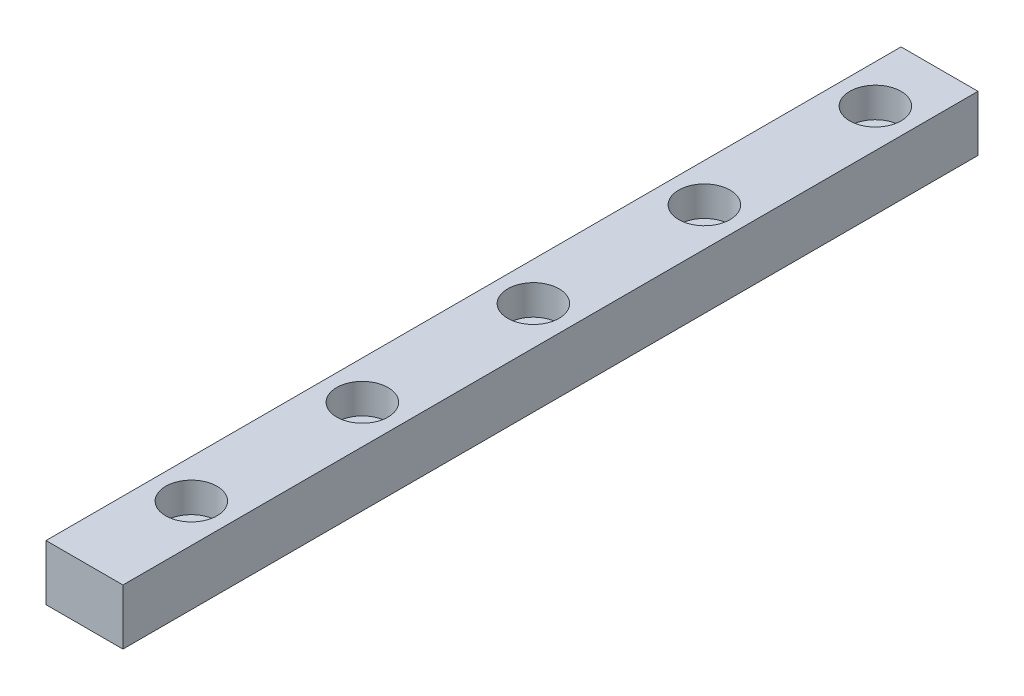
ISO-10303-21;
HEADER;
FILE_DESCRIPTION(('STEP AP214'),'2;1');
FILE_NAME('part.step','',(''),(''),'','','');
FILE_SCHEMA(('AUTOMOTIVE_DESIGN { 1 0 10303 214 1 1 1 1 }'));
ENDSEC;
DATA;
#1=APPLICATION_CONTEXT('core data for automotive mechanical design processes');
#2=APPLICATION_PROTOCOL_DEFINITION('international standard','automotive_design',2000,#1);
#3=PRODUCT_CONTEXT('',#1,'mechanical');
#4=PRODUCT('Part','Part','',(#3));
#5=PRODUCT_RELATED_PRODUCT_CATEGORY('part','',(#4));
#6=PRODUCT_DEFINITION_FORMATION('','',#4);
#7=PRODUCT_DEFINITION_CONTEXT('part definition',#1,'design');
#8=PRODUCT_DEFINITION('design','',#6,#7);
#9=PRODUCT_DEFINITION_SHAPE('','',#8);
#10=(LENGTH_UNIT() NAMED_UNIT(*) SI_UNIT(.MILLI.,.METRE.));
#11=(NAMED_UNIT(*) PLANE_ANGLE_UNIT() SI_UNIT($,.RADIAN.));
#12=(NAMED_UNIT(*) SI_UNIT($,.STERADIAN.) SOLID_ANGLE_UNIT());
#13=UNCERTAINTY_MEASURE_WITH_UNIT(LENGTH_MEASURE(1.E-05),#10,'distance_accuracy_value','');
#14=(GEOMETRIC_REPRESENTATION_CONTEXT(3) GLOBAL_UNCERTAINTY_ASSIGNED_CONTEXT((#13)) GLOBAL_UNIT_ASSIGNED_CONTEXT((#10,
#11,#12)) REPRESENTATION_CONTEXT('',''));
#15=CARTESIAN_POINT('',(0.,0.,0.));
#16=DIRECTION('',(0.,0.,1.));
#17=DIRECTION('',(1.,0.,0.));
#18=AXIS2_PLACEMENT_3D('',#15,#16,#17);
#19=CARTESIAN_POINT('',(8.23043630082632E-13,-3.25,-1.76483252234438));
#20=DIRECTION('',(0.,1.,0.));
#21=DIRECTION('',(0.,0.,1.));
#22=AXIS2_PLACEMENT_3D('',#19,#20,#21);
#23=CYLINDRICAL_SURFACE('',#22,1.75000000645171);
#24=CARTESIAN_POINT('',(8.23043630082632E-13,-3.25,-1.76483252234438));
#25=DIRECTION('',(0.,1.,0.));
#26=DIRECTION('',(0.,0.,1.));
#27=AXIS2_PLACEMENT_3D('',#24,#25,#26);
#28=CIRCLE('',#27,1.75000000645171);
#29=CARTESIAN_POINT('',(8.23043630082632E-13,-3.25,-0.0148325158926758));
#30=VERTEX_POINT('',#29);
#31=EDGE_CURVE('E131',#30,#30,#28,.T.);
#32=CARTESIAN_POINT('',(8.23043630082632E-13,-0.25,-1.76483252234438));
#33=DIRECTION('',(0.,1.,0.));
#34=DIRECTION('',(0.,0.,1.));
#35=AXIS2_PLACEMENT_3D('',#32,#33,#34);
#36=CIRCLE('',#35,1.75000000645171);
#37=CARTESIAN_POINT('',(8.23043630082632E-13,-0.25,-0.0148325158926758));
#38=VERTEX_POINT('',#37);
#39=EDGE_CURVE('E45',#38,#38,#36,.F.);
#40=CARTESIAN_POINT('',(8.23043630082632E-13,-3.25,-0.0148325158926758));
#41=CARTESIAN_POINT('',(8.23043630082632E-13,-3.21875,-0.0148325158926758));
#42=CARTESIAN_POINT('',(8.23043630082632E-13,-3.1875,-0.0148325158926758));
#43=CARTESIAN_POINT('',(8.23043630082632E-13,-3.125,-0.0148325158926758));
#44=CARTESIAN_POINT('',(8.23043630082632E-13,-3.09375,-0.0148325158926758));
#45=CARTESIAN_POINT('',(8.23043630082632E-13,-3.03125,-0.0148325158926758));
#46=CARTESIAN_POINT('',(8.23043630082632E-13,-3.,-0.0148325158926758));
#47=CARTESIAN_POINT('',(8.23043630082632E-13,-2.9375,-0.0148325158926758));
#48=CARTESIAN_POINT('',(8.23043630082632E-13,-2.90625,-0.0148325158926758));
#49=CARTESIAN_POINT('',(8.23043630082632E-13,-2.84375,-0.0148325158926758));
#50=CARTESIAN_POINT('',(8.23043630082632E-13,-2.8125,-0.0148325158926758));
#51=CARTESIAN_POINT('',(8.23043630082632E-13,-2.75,-0.0148325158926758));
#52=CARTESIAN_POINT('',(8.23043630082632E-13,-2.71875,-0.0148325158926758));
#53=CARTESIAN_POINT('',(8.23043630082632E-13,-2.65625,-0.0148325158926758));
#54=CARTESIAN_POINT('',(8.23043630082632E-13,-2.625,-0.0148325158926758));
#55=CARTESIAN_POINT('',(8.23043630082632E-13,-2.5625,-0.0148325158926758));
#56=CARTESIAN_POINT('',(8.23043630082632E-13,-2.53125,-0.0148325158926758));
#57=CARTESIAN_POINT('',(8.23043630082632E-13,-2.46875,-0.0148325158926758));
#58=CARTESIAN_POINT('',(8.23043630082632E-13,-2.4375,-0.0148325158926758));
#59=CARTESIAN_POINT('',(8.23043630082632E-13,-2.375,-0.0148325158926758));
#60=CARTESIAN_POINT('',(8.23043630082632E-13,-2.34375,-0.0148325158926758));
#61=CARTESIAN_POINT('',(8.23043630082632E-13,-2.28125,-0.0148325158926758));
#62=CARTESIAN_POINT('',(8.23043630082632E-13,-2.25,-0.0148325158926758));
#63=CARTESIAN_POINT('',(8.23043630082632E-13,-2.1875,-0.0148325158926758));
#64=CARTESIAN_POINT('',(8.23043630082632E-13,-2.15625,-0.0148325158926758));
#65=CARTESIAN_POINT('',(8.23043630082632E-13,-2.09375,-0.0148325158926758));
#66=CARTESIAN_POINT('',(8.23043630082632E-13,-2.0625,-0.0148325158926758));
#67=CARTESIAN_POINT('',(8.23043630082632E-13,-2.,-0.0148325158926758));
#68=CARTESIAN_POINT('',(8.23043630082632E-13,-1.96875,-0.0148325158926758));
#69=CARTESIAN_POINT('',(8.23043630082632E-13,-1.90625,-0.0148325158926758));
#70=CARTESIAN_POINT('',(8.23043630082632E-13,-1.875,-0.0148325158926758));
#71=CARTESIAN_POINT('',(8.23043630082632E-13,-1.8125,-0.0148325158926758));
#72=CARTESIAN_POINT('',(8.23043630082632E-13,-1.78125,-0.0148325158926758));
#73=CARTESIAN_POINT('',(8.23043630082632E-13,-1.71875,-0.0148325158926758));
#74=CARTESIAN_POINT('',(8.23043630082632E-13,-1.6875,-0.0148325158926758));
#75=CARTESIAN_POINT('',(8.23043630082632E-13,-1.625,-0.0148325158926758));
#76=CARTESIAN_POINT('',(8.23043630082632E-13,-1.59375,-0.0148325158926758));
#77=CARTESIAN_POINT('',(8.23043630082632E-13,-1.53125,-0.0148325158926758));
#78=CARTESIAN_POINT('',(8.23043630082632E-13,-1.5,-0.0148325158926758));
#79=CARTESIAN_POINT('',(8.23043630082632E-13,-1.4375,-0.0148325158926758));
#80=CARTESIAN_POINT('',(8.23043630082632E-13,-1.40625,-0.0148325158926758));
#81=CARTESIAN_POINT('',(8.23043630082632E-13,-1.34375,-0.0148325158926758));
#82=CARTESIAN_POINT('',(8.23043630082632E-13,-1.3125,-0.0148325158926758));
#83=CARTESIAN_POINT('',(8.23043630082632E-13,-1.25,-0.0148325158926758));
#84=CARTESIAN_POINT('',(8.23043630082632E-13,-1.21875,-0.0148325158926758));
#85=CARTESIAN_POINT('',(8.23043630082632E-13,-1.15625,-0.0148325158926758));
#86=CARTESIAN_POINT('',(8.23043630082632E-13,-1.125,-0.0148325158926758));
#87=CARTESIAN_POINT('',(8.23043630082632E-13,-1.0625,-0.0148325158926758));
#88=CARTESIAN_POINT('',(8.23043630082632E-13,-1.03125,-0.0148325158926758));
#89=CARTESIAN_POINT('',(8.23043630082632E-13,-0.96875,-0.0148325158926758));
#90=CARTESIAN_POINT('',(8.23043630082632E-13,-0.9375,-0.0148325158926758));
#91=CARTESIAN_POINT('',(8.23043630082632E-13,-0.875,-0.0148325158926758));
#92=CARTESIAN_POINT('',(8.23043630082632E-13,-0.84375,-0.0148325158926758));
#93=CARTESIAN_POINT('',(8.23043630082632E-13,-0.78125,-0.0148325158926758));
#94=CARTESIAN_POINT('',(8.23043630082632E-13,-0.75,-0.0148325158926758));
#95=CARTESIAN_POINT('',(8.23043630082632E-13,-0.6875,-0.0148325158926758));
#96=CARTESIAN_POINT('',(8.23043630082632E-13,-0.65625,-0.0148325158926758));
#97=CARTESIAN_POINT('',(8.23043630082632E-13,-0.59375,-0.0148325158926758));
#98=CARTESIAN_POINT('',(8.23043630082632E-13,-0.5625,-0.0148325158926758));
#99=CARTESIAN_POINT('',(8.23043630082632E-13,-0.5,-0.0148325158926758));
#100=CARTESIAN_POINT('',(8.23043630082632E-13,-0.46875,-0.0148325158926758));
#101=CARTESIAN_POINT('',(8.23043630082632E-13,-0.40625,-0.0148325158926758));
#102=CARTESIAN_POINT('',(8.23043630082632E-13,-0.375,-0.0148325158926758));
#103=CARTESIAN_POINT('',(8.23043630082632E-13,-0.3125,-0.0148325158926758));
#104=CARTESIAN_POINT('',(8.23043630082632E-13,-0.28125,-0.0148325158926758));
#105=CARTESIAN_POINT('',(8.23043630082632E-13,-0.25,-0.0148325158926758));
#106=B_SPLINE_CURVE_WITH_KNOTS('',3,(#40,#41,#42,#43,#44,#45,#46,#47,#48,#49,#50,#51,#52,#53,
#54,#55,#56,#57,#58,#59,#60,#61,#62,#63,#64,#65,#66,#67,#68,#69,#70,#71,#72,#73,#74,#75,#76,#77,
#78,#79,#80,#81,#82,#83,#84,#85,#86,#87,#88,#89,#90,#91,#92,#93,#94,#95,#96,#97,#98,#99,#100,
#101,#102,#103,#104,#105),.UNSPECIFIED.,.F.,.F.,(4,2,2,2,2,2,2,2,2,2,2,2,2,2,2,2,2,2,2,2,2,2,2,
2,2,2,2,2,2,2,2,2,4),(0.,0.0937499999999997,0.1875,0.28125,0.375,0.46875,0.5625,0.65625,0.75,
0.84375,0.9375,1.03125,1.125,1.21875,1.3125,1.40625,1.5,1.59375,1.6875,1.78125,1.875,1.96875,
2.0625,2.15625,2.25,2.34375,2.4375,2.53125,2.625,2.71875,2.8125,2.90625,3.),.UNSPECIFIED.);
#107=EDGE_CURVE('BSEAM41',#30,#38,#106,.T.);
#108=ORIENTED_EDGE('',*,*,#31,.F.);
#109=ORIENTED_EDGE('',*,*,#39,.F.);
#110=ORIENTED_EDGE('',*,*,#107,.T.);
#111=ORIENTED_EDGE('',*,*,#107,.F.);
#112=EDGE_LOOP('',(#108,#110,#109,#111));
#113=FACE_BOUND('',#112,.T.);
#114=ADVANCED_FACE('F41',(#113),#23,.F.);
#115=CARTESIAN_POINT('',(6.14779396551191E-13,-3.25,-21.7648325223444));
#116=DIRECTION('',(0.,1.,0.));
#117=DIRECTION('',(0.,0.,1.));
#118=AXIS2_PLACEMENT_3D('',#115,#116,#117);
#119=CYLINDRICAL_SURFACE('',#118,1.75000000645171);
#120=CARTESIAN_POINT('',(6.14779396551191E-13,-3.25,-21.7648325223444));
#121=DIRECTION('',(0.,1.,0.));
#122=DIRECTION('',(0.,0.,1.));
#123=AXIS2_PLACEMENT_3D('',#120,#121,#122);
#124=CIRCLE('',#123,1.75000000645171);
#125=CARTESIAN_POINT('',(6.14779396551191E-13,-3.25,-20.0148325158927));
#126=VERTEX_POINT('',#125);
#127=EDGE_CURVE('E135',#126,#126,#124,.T.);
#128=CARTESIAN_POINT('',(6.14779396551191E-13,-0.25,-21.7648325223444));
#129=DIRECTION('',(0.,1.,0.));
#130=DIRECTION('',(0.,0.,1.));
#131=AXIS2_PLACEMENT_3D('',#128,#129,#130);
#132=CIRCLE('',#131,1.75000000645171);
#133=CARTESIAN_POINT('',(6.14779396551191E-13,-0.25,-20.0148325158927));
#134=VERTEX_POINT('',#133);
#135=EDGE_CURVE('E126',#134,#134,#132,.F.);
#136=CARTESIAN_POINT('',(6.14779396551191E-13,-3.25,-20.0148325158927));
#137=CARTESIAN_POINT('',(6.14779396551191E-13,-3.21875,-20.0148325158927));
#138=CARTESIAN_POINT('',(6.14779396551191E-13,-3.1875,-20.0148325158927));
#139=CARTESIAN_POINT('',(6.14779396551191E-13,-3.125,-20.0148325158927));
#140=CARTESIAN_POINT('',(6.14779396551191E-13,-3.09375,-20.0148325158927));
#141=CARTESIAN_POINT('',(6.14779396551191E-13,-3.03125,-20.0148325158927));
#142=CARTESIAN_POINT('',(6.14779396551191E-13,-3.,-20.0148325158927));
#143=CARTESIAN_POINT('',(6.14779396551191E-13,-2.9375,-20.0148325158927));
#144=CARTESIAN_POINT('',(6.14779396551191E-13,-2.90625,-20.0148325158927));
#145=CARTESIAN_POINT('',(6.14779396551191E-13,-2.84375,-20.0148325158927));
#146=CARTESIAN_POINT('',(6.14779396551191E-13,-2.8125,-20.0148325158927));
#147=CARTESIAN_POINT('',(6.14779396551191E-13,-2.75,-20.0148325158927));
#148=CARTESIAN_POINT('',(6.14779396551191E-13,-2.71875,-20.0148325158927));
#149=CARTESIAN_POINT('',(6.14779396551191E-13,-2.65625,-20.0148325158927));
#150=CARTESIAN_POINT('',(6.14779396551191E-13,-2.625,-20.0148325158927));
#151=CARTESIAN_POINT('',(6.14779396551191E-13,-2.5625,-20.0148325158927));
#152=CARTESIAN_POINT('',(6.14779396551191E-13,-2.53125,-20.0148325158927));
#153=CARTESIAN_POINT('',(6.14779396551191E-13,-2.46875,-20.0148325158927));
#154=CARTESIAN_POINT('',(6.14779396551191E-13,-2.4375,-20.0148325158927));
#155=CARTESIAN_POINT('',(6.14779396551191E-13,-2.375,-20.0148325158927));
#156=CARTESIAN_POINT('',(6.14779396551191E-13,-2.34375,-20.0148325158927));
#157=CARTESIAN_POINT('',(6.14779396551191E-13,-2.28125,-20.0148325158927));
#158=CARTESIAN_POINT('',(6.14779396551191E-13,-2.25,-20.0148325158927));
#159=CARTESIAN_POINT('',(6.14779396551191E-13,-2.1875,-20.0148325158927));
#160=CARTESIAN_POINT('',(6.14779396551191E-13,-2.15625,-20.0148325158927));
#161=CARTESIAN_POINT('',(6.14779396551191E-13,-2.09375,-20.0148325158927));
#162=CARTESIAN_POINT('',(6.14779396551191E-13,-2.0625,-20.0148325158927));
#163=CARTESIAN_POINT('',(6.14779396551191E-13,-2.,-20.0148325158927));
#164=CARTESIAN_POINT('',(6.14779396551191E-13,-1.96875,-20.0148325158927));
#165=CARTESIAN_POINT('',(6.14779396551191E-13,-1.90625,-20.0148325158927));
#166=CARTESIAN_POINT('',(6.14779396551191E-13,-1.875,-20.0148325158927));
#167=CARTESIAN_POINT('',(6.14779396551191E-13,-1.8125,-20.0148325158927));
#168=CARTESIAN_POINT('',(6.14779396551191E-13,-1.78125,-20.0148325158927));
#169=CARTESIAN_POINT('',(6.14779396551191E-13,-1.71875,-20.0148325158927));
#170=CARTESIAN_POINT('',(6.14779396551191E-13,-1.6875,-20.0148325158927));
#171=CARTESIAN_POINT('',(6.14779396551191E-13,-1.625,-20.0148325158927));
#172=CARTESIAN_POINT('',(6.14779396551191E-13,-1.59375,-20.0148325158927));
#173=CARTESIAN_POINT('',(6.14779396551191E-13,-1.53125,-20.0148325158927));
#174=CARTESIAN_POINT('',(6.14779396551191E-13,-1.5,-20.0148325158927));
#175=CARTESIAN_POINT('',(6.14779396551191E-13,-1.4375,-20.0148325158927));
#176=CARTESIAN_POINT('',(6.14779396551191E-13,-1.40625,-20.0148325158927));
#177=CARTESIAN_POINT('',(6.14779396551191E-13,-1.34375,-20.0148325158927));
#178=CARTESIAN_POINT('',(6.14779396551191E-13,-1.3125,-20.0148325158927));
#179=CARTESIAN_POINT('',(6.14779396551191E-13,-1.25,-20.0148325158927));
#180=CARTESIAN_POINT('',(6.14779396551191E-13,-1.21875,-20.0148325158927));
#181=CARTESIAN_POINT('',(6.14779396551191E-13,-1.15625,-20.0148325158927));
#182=CARTESIAN_POINT('',(6.14779396551191E-13,-1.125,-20.0148325158927));
#183=CARTESIAN_POINT('',(6.14779396551191E-13,-1.0625,-20.0148325158927));
#184=CARTESIAN_POINT('',(6.14779396551191E-13,-1.03125,-20.0148325158927));
#185=CARTESIAN_POINT('',(6.14779396551191E-13,-0.96875,-20.0148325158927));
#186=CARTESIAN_POINT('',(6.14779396551191E-13,-0.9375,-20.0148325158927));
#187=CARTESIAN_POINT('',(6.14779396551191E-13,-0.875,-20.0148325158927));
#188=CARTESIAN_POINT('',(6.14779396551191E-13,-0.84375,-20.0148325158927));
#189=CARTESIAN_POINT('',(6.14779396551191E-13,-0.78125,-20.0148325158927));
#190=CARTESIAN_POINT('',(6.14779396551191E-13,-0.75,-20.0148325158927));
#191=CARTESIAN_POINT('',(6.14779396551191E-13,-0.6875,-20.0148325158927));
#192=CARTESIAN_POINT('',(6.14779396551191E-13,-0.65625,-20.0148325158927));
#193=CARTESIAN_POINT('',(6.14779396551191E-13,-0.59375,-20.0148325158927));
#194=CARTESIAN_POINT('',(6.14779396551191E-13,-0.5625,-20.0148325158927));
#195=CARTESIAN_POINT('',(6.14779396551191E-13,-0.5,-20.0148325158927));
#196=CARTESIAN_POINT('',(6.14779396551191E-13,-0.46875,-20.0148325158927));
#197=CARTESIAN_POINT('',(6.14779396551191E-13,-0.40625,-20.0148325158927));
#198=CARTESIAN_POINT('',(6.14779396551191E-13,-0.375,-20.0148325158927));
#199=CARTESIAN_POINT('',(6.14779396551191E-13,-0.3125,-20.0148325158927));
#200=CARTESIAN_POINT('',(6.14779396551191E-13,-0.28125,-20.0148325158927));
#201=CARTESIAN_POINT('',(6.14779396551191E-13,-0.25,-20.0148325158927));
#202=B_SPLINE_CURVE_WITH_KNOTS('',3,(#136,#137,#138,#139,#140,#141,#142,#143,#144,#145,#146,
#147,#148,#149,#150,#151,#152,#153,#154,#155,#156,#157,#158,#159,#160,#161,#162,#163,#164,#165,
#166,#167,#168,#169,#170,#171,#172,#173,#174,#175,#176,#177,#178,#179,#180,#181,#182,#183,#184,
#185,#186,#187,#188,#189,#190,#191,#192,#193,#194,#195,#196,#197,#198,#199,#200,#201),
.UNSPECIFIED.,.F.,.F.,(4,2,2,2,2,2,2,2,2,2,2,2,2,2,2,2,2,2,2,2,2,2,2,2,2,2,2,2,2,2,2,2,4),(0.,
0.0937499999999997,0.1875,0.28125,0.375,0.46875,0.5625,0.65625,0.75,0.84375,0.9375,1.03125,
1.125,1.21875,1.3125,1.40625,1.5,1.59375,1.6875,1.78125,1.875,1.96875,2.0625,2.15625,2.25,
2.34375,2.4375,2.53125,2.625,2.71875,2.8125,2.90625,3.),.UNSPECIFIED.);
#203=EDGE_CURVE('BSEAM214',#126,#134,#202,.T.);
#204=ORIENTED_EDGE('',*,*,#127,.F.);
#205=ORIENTED_EDGE('',*,*,#135,.F.);
#206=ORIENTED_EDGE('',*,*,#203,.T.);
#207=ORIENTED_EDGE('',*,*,#203,.F.);
#208=EDGE_LOOP('',(#204,#206,#205,#207));
#209=FACE_BOUND('',#208,.T.);
#210=ADVANCED_FACE('F214',(#209),#119,.F.);
#211=CARTESIAN_POINT('',(4.0651516301975E-13,-3.25,-41.7648325223444));
#212=DIRECTION('',(0.,1.,0.));
#213=DIRECTION('',(0.,0.,1.));
#214=AXIS2_PLACEMENT_3D('',#211,#212,#213);
#215=CYLINDRICAL_SURFACE('',#214,1.75000000645171);
#216=CARTESIAN_POINT('',(4.0651516301975E-13,-3.25,-41.7648325223444));
#217=DIRECTION('',(0.,1.,0.));
#218=DIRECTION('',(0.,0.,1.));
#219=AXIS2_PLACEMENT_3D('',#216,#217,#218);
#220=CIRCLE('',#219,1.75000000645171);
#221=CARTESIAN_POINT('',(4.0651516301975E-13,-3.25,-40.0148325158927));
#222=VERTEX_POINT('',#221);
#223=EDGE_CURVE('E140',#222,#222,#220,.T.);
#224=CARTESIAN_POINT('',(4.0651516301975E-13,-0.25,-41.7648325223444));
#225=DIRECTION('',(0.,1.,0.));
#226=DIRECTION('',(0.,0.,1.));
#227=AXIS2_PLACEMENT_3D('',#224,#225,#226);
#228=CIRCLE('',#227,1.75000000645171);
#229=CARTESIAN_POINT('',(4.0651516301975E-13,-0.25,-40.0148325158927));
#230=VERTEX_POINT('',#229);
#231=EDGE_CURVE('E124',#230,#230,#228,.F.);
#232=CARTESIAN_POINT('',(4.0651516301975E-13,-3.25,-40.0148325158927));
#233=CARTESIAN_POINT('',(4.0651516301975E-13,-3.21875,-40.0148325158927));
#234=CARTESIAN_POINT('',(4.0651516301975E-13,-3.1875,-40.0148325158927));
#235=CARTESIAN_POINT('',(4.0651516301975E-13,-3.125,-40.0148325158927));
#236=CARTESIAN_POINT('',(4.0651516301975E-13,-3.09375,-40.0148325158927));
#237=CARTESIAN_POINT('',(4.0651516301975E-13,-3.03125,-40.0148325158927));
#238=CARTESIAN_POINT('',(4.0651516301975E-13,-3.,-40.0148325158927));
#239=CARTESIAN_POINT('',(4.0651516301975E-13,-2.9375,-40.0148325158927));
#240=CARTESIAN_POINT('',(4.0651516301975E-13,-2.90625,-40.0148325158927));
#241=CARTESIAN_POINT('',(4.0651516301975E-13,-2.84375,-40.0148325158927));
#242=CARTESIAN_POINT('',(4.0651516301975E-13,-2.8125,-40.0148325158927));
#243=CARTESIAN_POINT('',(4.0651516301975E-13,-2.75,-40.0148325158927));
#244=CARTESIAN_POINT('',(4.0651516301975E-13,-2.71875,-40.0148325158927));
#245=CARTESIAN_POINT('',(4.0651516301975E-13,-2.65625,-40.0148325158927));
#246=CARTESIAN_POINT('',(4.0651516301975E-13,-2.625,-40.0148325158927));
#247=CARTESIAN_POINT('',(4.0651516301975E-13,-2.5625,-40.0148325158927));
#248=CARTESIAN_POINT('',(4.0651516301975E-13,-2.53125,-40.0148325158927));
#249=CARTESIAN_POINT('',(4.0651516301975E-13,-2.46875,-40.0148325158927));
#250=CARTESIAN_POINT('',(4.0651516301975E-13,-2.4375,-40.0148325158927));
#251=CARTESIAN_POINT('',(4.0651516301975E-13,-2.375,-40.0148325158927));
#252=CARTESIAN_POINT('',(4.0651516301975E-13,-2.34375,-40.0148325158927));
#253=CARTESIAN_POINT('',(4.0651516301975E-13,-2.28125,-40.0148325158927));
#254=CARTESIAN_POINT('',(4.0651516301975E-13,-2.25,-40.0148325158927));
#255=CARTESIAN_POINT('',(4.0651516301975E-13,-2.1875,-40.0148325158927));
#256=CARTESIAN_POINT('',(4.0651516301975E-13,-2.15625,-40.0148325158927));
#257=CARTESIAN_POINT('',(4.0651516301975E-13,-2.09375,-40.0148325158927));
#258=CARTESIAN_POINT('',(4.0651516301975E-13,-2.0625,-40.0148325158927));
#259=CARTESIAN_POINT('',(4.0651516301975E-13,-2.,-40.0148325158927));
#260=CARTESIAN_POINT('',(4.0651516301975E-13,-1.96875,-40.0148325158927));
#261=CARTESIAN_POINT('',(4.0651516301975E-13,-1.90625,-40.0148325158927));
#262=CARTESIAN_POINT('',(4.0651516301975E-13,-1.875,-40.0148325158927));
#263=CARTESIAN_POINT('',(4.0651516301975E-13,-1.8125,-40.0148325158927));
#264=CARTESIAN_POINT('',(4.0651516301975E-13,-1.78125,-40.0148325158927));
#265=CARTESIAN_POINT('',(4.0651516301975E-13,-1.71875,-40.0148325158927));
#266=CARTESIAN_POINT('',(4.0651516301975E-13,-1.6875,-40.0148325158927));
#267=CARTESIAN_POINT('',(4.0651516301975E-13,-1.625,-40.0148325158927));
#268=CARTESIAN_POINT('',(4.0651516301975E-13,-1.59375,-40.0148325158927));
#269=CARTESIAN_POINT('',(4.0651516301975E-13,-1.53125,-40.0148325158927));
#270=CARTESIAN_POINT('',(4.0651516301975E-13,-1.5,-40.0148325158927));
#271=CARTESIAN_POINT('',(4.0651516301975E-13,-1.4375,-40.0148325158927));
#272=CARTESIAN_POINT('',(4.0651516301975E-13,-1.40625,-40.0148325158927));
#273=CARTESIAN_POINT('',(4.0651516301975E-13,-1.34375,-40.0148325158927));
#274=CARTESIAN_POINT('',(4.0651516301975E-13,-1.3125,-40.0148325158927));
#275=CARTESIAN_POINT('',(4.0651516301975E-13,-1.25,-40.0148325158927));
#276=CARTESIAN_POINT('',(4.0651516301975E-13,-1.21875,-40.0148325158927));
#277=CARTESIAN_POINT('',(4.0651516301975E-13,-1.15625,-40.0148325158927));
#278=CARTESIAN_POINT('',(4.0651516301975E-13,-1.125,-40.0148325158927));
#279=CARTESIAN_POINT('',(4.0651516301975E-13,-1.0625,-40.0148325158927));
#280=CARTESIAN_POINT('',(4.0651516301975E-13,-1.03125,-40.0148325158927));
#281=CARTESIAN_POINT('',(4.0651516301975E-13,-0.96875,-40.0148325158927));
#282=CARTESIAN_POINT('',(4.0651516301975E-13,-0.9375,-40.0148325158927));
#283=CARTESIAN_POINT('',(4.0651516301975E-13,-0.875,-40.0148325158927));
#284=CARTESIAN_POINT('',(4.0651516301975E-13,-0.84375,-40.0148325158927));
#285=CARTESIAN_POINT('',(4.0651516301975E-13,-0.78125,-40.0148325158927));
#286=CARTESIAN_POINT('',(4.0651516301975E-13,-0.75,-40.0148325158927));
#287=CARTESIAN_POINT('',(4.0651516301975E-13,-0.6875,-40.0148325158927));
#288=CARTESIAN_POINT('',(4.0651516301975E-13,-0.65625,-40.0148325158927));
#289=CARTESIAN_POINT('',(4.0651516301975E-13,-0.59375,-40.0148325158927));
#290=CARTESIAN_POINT('',(4.0651516301975E-13,-0.5625,-40.0148325158927));
#291=CARTESIAN_POINT('',(4.0651516301975E-13,-0.5,-40.0148325158927));
#292=CARTESIAN_POINT('',(4.0651516301975E-13,-0.46875,-40.0148325158927));
#293=CARTESIAN_POINT('',(4.0651516301975E-13,-0.40625,-40.0148325158927));
#294=CARTESIAN_POINT('',(4.0651516301975E-13,-0.375,-40.0148325158927));
#295=CARTESIAN_POINT('',(4.0651516301975E-13,-0.3125,-40.0148325158927));
#296=CARTESIAN_POINT('',(4.0651516301975E-13,-0.28125,-40.0148325158927));
#297=CARTESIAN_POINT('',(4.0651516301975E-13,-0.25,-40.0148325158927));
#298=B_SPLINE_CURVE_WITH_KNOTS('',3,(#232,#233,#234,#235,#236,#237,#238,#239,#240,#241,#242,
#243,#244,#245,#246,#247,#248,#249,#250,#251,#252,#253,#254,#255,#256,#257,#258,#259,#260,#261,
#262,#263,#264,#265,#266,#267,#268,#269,#270,#271,#272,#273,#274,#275,#276,#277,#278,#279,#280,
#281,#282,#283,#284,#285,#286,#287,#288,#289,#290,#291,#292,#293,#294,#295,#296,#297),
.UNSPECIFIED.,.F.,.F.,(4,2,2,2,2,2,2,2,2,2,2,2,2,2,2,2,2,2,2,2,2,2,2,2,2,2,2,2,2,2,2,2,4),(0.,
0.0937499999999997,0.1875,0.28125,0.375,0.46875,0.5625,0.65625,0.75,0.84375,0.9375,1.03125,
1.125,1.21875,1.3125,1.40625,1.5,1.59375,1.6875,1.78125,1.875,1.96875,2.0625,2.15625,2.25,
2.34375,2.4375,2.53125,2.625,2.71875,2.8125,2.90625,3.),.UNSPECIFIED.);
#299=EDGE_CURVE('BSEAM221',#222,#230,#298,.T.);
#300=ORIENTED_EDGE('',*,*,#223,.F.);
#301=ORIENTED_EDGE('',*,*,#231,.F.);
#302=ORIENTED_EDGE('',*,*,#299,.T.);
#303=ORIENTED_EDGE('',*,*,#299,.F.);
#304=EDGE_LOOP('',(#300,#302,#301,#303));
#305=FACE_BOUND('',#304,.T.);
#306=ADVANCED_FACE('F221',(#305),#215,.F.);
#307=CARTESIAN_POINT('',(1.9825092948831E-13,-3.25,-61.7648325223444));
#308=DIRECTION('',(0.,1.,0.));
#309=DIRECTION('',(0.,0.,1.));
#310=AXIS2_PLACEMENT_3D('',#307,#308,#309);
#311=CYLINDRICAL_SURFACE('',#310,1.75000000645171);
#312=CARTESIAN_POINT('',(1.9825092948831E-13,-3.25,-61.7648325223444));
#313=DIRECTION('',(0.,1.,0.));
#314=DIRECTION('',(0.,0.,1.));
#315=AXIS2_PLACEMENT_3D('',#312,#313,#314);
#316=CIRCLE('',#315,1.75000000645171);
#317=CARTESIAN_POINT('',(1.9825092948831E-13,-3.25,-60.0148325158927));
#318=VERTEX_POINT('',#317);
#319=EDGE_CURVE('E145',#318,#318,#316,.T.);
#320=CARTESIAN_POINT('',(1.9825092948831E-13,-0.25,-61.7648325223444));
#321=DIRECTION('',(0.,1.,0.));
#322=DIRECTION('',(0.,0.,1.));
#323=AXIS2_PLACEMENT_3D('',#320,#321,#322);
#324=CIRCLE('',#323,1.75000000645171);
#325=CARTESIAN_POINT('',(1.9825092948831E-13,-0.25,-60.0148325158927));
#326=VERTEX_POINT('',#325);
#327=EDGE_CURVE('E120',#326,#326,#324,.F.);
#328=CARTESIAN_POINT('',(1.9825092948831E-13,-3.25,-60.0148325158927));
#329=CARTESIAN_POINT('',(1.9825092948831E-13,-3.21875,-60.0148325158927));
#330=CARTESIAN_POINT('',(1.9825092948831E-13,-3.1875,-60.0148325158927));
#331=CARTESIAN_POINT('',(1.9825092948831E-13,-3.125,-60.0148325158927));
#332=CARTESIAN_POINT('',(1.9825092948831E-13,-3.09375,-60.0148325158927));
#333=CARTESIAN_POINT('',(1.9825092948831E-13,-3.03125,-60.0148325158927));
#334=CARTESIAN_POINT('',(1.9825092948831E-13,-3.,-60.0148325158927));
#335=CARTESIAN_POINT('',(1.9825092948831E-13,-2.9375,-60.0148325158927));
#336=CARTESIAN_POINT('',(1.9825092948831E-13,-2.90625,-60.0148325158927));
#337=CARTESIAN_POINT('',(1.9825092948831E-13,-2.84375,-60.0148325158927));
#338=CARTESIAN_POINT('',(1.9825092948831E-13,-2.8125,-60.0148325158927));
#339=CARTESIAN_POINT('',(1.9825092948831E-13,-2.75,-60.0148325158927));
#340=CARTESIAN_POINT('',(1.9825092948831E-13,-2.71875,-60.0148325158927));
#341=CARTESIAN_POINT('',(1.9825092948831E-13,-2.65625,-60.0148325158927));
#342=CARTESIAN_POINT('',(1.9825092948831E-13,-2.625,-60.0148325158927));
#343=CARTESIAN_POINT('',(1.9825092948831E-13,-2.5625,-60.0148325158927));
#344=CARTESIAN_POINT('',(1.9825092948831E-13,-2.53125,-60.0148325158927));
#345=CARTESIAN_POINT('',(1.9825092948831E-13,-2.46875,-60.0148325158927));
#346=CARTESIAN_POINT('',(1.9825092948831E-13,-2.4375,-60.0148325158927));
#347=CARTESIAN_POINT('',(1.9825092948831E-13,-2.375,-60.0148325158927));
#348=CARTESIAN_POINT('',(1.9825092948831E-13,-2.34375,-60.0148325158927));
#349=CARTESIAN_POINT('',(1.9825092948831E-13,-2.28125,-60.0148325158927));
#350=CARTESIAN_POINT('',(1.9825092948831E-13,-2.25,-60.0148325158927));
#351=CARTESIAN_POINT('',(1.9825092948831E-13,-2.1875,-60.0148325158927));
#352=CARTESIAN_POINT('',(1.9825092948831E-13,-2.15625,-60.0148325158927));
#353=CARTESIAN_POINT('',(1.9825092948831E-13,-2.09375,-60.0148325158927));
#354=CARTESIAN_POINT('',(1.9825092948831E-13,-2.0625,-60.0148325158927));
#355=CARTESIAN_POINT('',(1.9825092948831E-13,-2.,-60.0148325158927));
#356=CARTESIAN_POINT('',(1.9825092948831E-13,-1.96875,-60.0148325158927));
#357=CARTESIAN_POINT('',(1.9825092948831E-13,-1.90625,-60.0148325158927));
#358=CARTESIAN_POINT('',(1.9825092948831E-13,-1.875,-60.0148325158927));
#359=CARTESIAN_POINT('',(1.9825092948831E-13,-1.8125,-60.0148325158927));
#360=CARTESIAN_POINT('',(1.9825092948831E-13,-1.78125,-60.0148325158927));
#361=CARTESIAN_POINT('',(1.9825092948831E-13,-1.71875,-60.0148325158927));
#362=CARTESIAN_POINT('',(1.9825092948831E-13,-1.6875,-60.0148325158927));
#363=CARTESIAN_POINT('',(1.9825092948831E-13,-1.625,-60.0148325158927));
#364=CARTESIAN_POINT('',(1.9825092948831E-13,-1.59375,-60.0148325158927));
#365=CARTESIAN_POINT('',(1.9825092948831E-13,-1.53125,-60.0148325158927));
#366=CARTESIAN_POINT('',(1.9825092948831E-13,-1.5,-60.0148325158927));
#367=CARTESIAN_POINT('',(1.9825092948831E-13,-1.4375,-60.0148325158927));
#368=CARTESIAN_POINT('',(1.9825092948831E-13,-1.40625,-60.0148325158927));
#369=CARTESIAN_POINT('',(1.9825092948831E-13,-1.34375,-60.0148325158927));
#370=CARTESIAN_POINT('',(1.9825092948831E-13,-1.3125,-60.0148325158927));
#371=CARTESIAN_POINT('',(1.9825092948831E-13,-1.25,-60.0148325158927));
#372=CARTESIAN_POINT('',(1.9825092948831E-13,-1.21875,-60.0148325158927));
#373=CARTESIAN_POINT('',(1.9825092948831E-13,-1.15625,-60.0148325158927));
#374=CARTESIAN_POINT('',(1.9825092948831E-13,-1.125,-60.0148325158927));
#375=CARTESIAN_POINT('',(1.9825092948831E-13,-1.0625,-60.0148325158927));
#376=CARTESIAN_POINT('',(1.9825092948831E-13,-1.03125,-60.0148325158927));
#377=CARTESIAN_POINT('',(1.9825092948831E-13,-0.96875,-60.0148325158927));
#378=CARTESIAN_POINT('',(1.9825092948831E-13,-0.9375,-60.0148325158927));
#379=CARTESIAN_POINT('',(1.9825092948831E-13,-0.875,-60.0148325158927));
#380=CARTESIAN_POINT('',(1.9825092948831E-13,-0.84375,-60.0148325158927));
#381=CARTESIAN_POINT('',(1.9825092948831E-13,-0.78125,-60.0148325158927));
#382=CARTESIAN_POINT('',(1.9825092948831E-13,-0.75,-60.0148325158927));
#383=CARTESIAN_POINT('',(1.9825092948831E-13,-0.6875,-60.0148325158927));
#384=CARTESIAN_POINT('',(1.9825092948831E-13,-0.65625,-60.0148325158927));
#385=CARTESIAN_POINT('',(1.9825092948831E-13,-0.59375,-60.0148325158927));
#386=CARTESIAN_POINT('',(1.9825092948831E-13,-0.5625,-60.0148325158927));
#387=CARTESIAN_POINT('',(1.9825092948831E-13,-0.5,-60.0148325158927));
#388=CARTESIAN_POINT('',(1.9825092948831E-13,-0.46875,-60.0148325158927));
#389=CARTESIAN_POINT('',(1.9825092948831E-13,-0.40625,-60.0148325158927));
#390=CARTESIAN_POINT('',(1.9825092948831E-13,-0.375,-60.0148325158927));
#391=CARTESIAN_POINT('',(1.9825092948831E-13,-0.3125,-60.0148325158927));
#392=CARTESIAN_POINT('',(1.9825092948831E-13,-0.28125,-60.0148325158927));
#393=CARTESIAN_POINT('',(1.9825092948831E-13,-0.25,-60.0148325158927));
#394=B_SPLINE_CURVE_WITH_KNOTS('',3,(#328,#329,#330,#331,#332,#333,#334,#335,#336,#337,#338,
#339,#340,#341,#342,#343,#344,#345,#346,#347,#348,#349,#350,#351,#352,#353,#354,#355,#356,#357,
#358,#359,#360,#361,#362,#363,#364,#365,#366,#367,#368,#369,#370,#371,#372,#373,#374,#375,#376,
#377,#378,#379,#380,#381,#382,#383,#384,#385,#386,#387,#388,#389,#390,#391,#392,#393),
.UNSPECIFIED.,.F.,.F.,(4,2,2,2,2,2,2,2,2,2,2,2,2,2,2,2,2,2,2,2,2,2,2,2,2,2,2,2,2,2,2,2,4),(0.,
0.0937499999999997,0.1875,0.28125,0.375,0.46875,0.5625,0.65625,0.75,0.84375,0.9375,1.03125,
1.125,1.21875,1.3125,1.40625,1.5,1.59375,1.6875,1.78125,1.875,1.96875,2.0625,2.15625,2.25,
2.34375,2.4375,2.53125,2.625,2.71875,2.8125,2.90625,3.),.UNSPECIFIED.);
#395=EDGE_CURVE('BSEAM272',#318,#326,#394,.T.);
#396=ORIENTED_EDGE('',*,*,#319,.F.);
#397=ORIENTED_EDGE('',*,*,#327,.F.);
#398=ORIENTED_EDGE('',*,*,#395,.T.);
#399=ORIENTED_EDGE('',*,*,#395,.F.);
#400=EDGE_LOOP('',(#396,#398,#397,#399));
#401=FACE_BOUND('',#400,.T.);
#402=ADVANCED_FACE('F272',(#401),#311,.F.);
#403=CARTESIAN_POINT('',(0.,-3.25,-81.7648325223444));
#404=DIRECTION('',(0.,1.,0.));
#405=DIRECTION('',(0.,0.,1.));
#406=AXIS2_PLACEMENT_3D('',#403,#404,#405);
#407=CYLINDRICAL_SURFACE('',#406,1.75000000645171);
#408=CARTESIAN_POINT('',(0.,-3.25,-81.7648325223444));
#409=DIRECTION('',(0.,1.,0.));
#410=DIRECTION('',(0.,0.,1.));
#411=AXIS2_PLACEMENT_3D('',#408,#409,#410);
#412=CIRCLE('',#411,1.75000000645171);
#413=CARTESIAN_POINT('',(0.,-3.25,-80.0148325158927));
#414=VERTEX_POINT('',#413);
#415=EDGE_CURVE('E111',#414,#414,#412,.T.);
#416=CARTESIAN_POINT('',(0.,-0.25,-81.7648325223444));
#417=DIRECTION('',(0.,1.,0.));
#418=DIRECTION('',(0.,0.,1.));
#419=AXIS2_PLACEMENT_3D('',#416,#417,#418);
#420=CIRCLE('',#419,1.75000000645171);
#421=CARTESIAN_POINT('',(0.,-0.25,-80.0148325158927));
#422=VERTEX_POINT('',#421);
#423=EDGE_CURVE('E117',#422,#422,#420,.F.);
#424=CARTESIAN_POINT('',(0.,-3.25,-80.0148325158927));
#425=CARTESIAN_POINT('',(0.,-3.21875,-80.0148325158927));
#426=CARTESIAN_POINT('',(0.,-3.1875,-80.0148325158927));
#427=CARTESIAN_POINT('',(0.,-3.125,-80.0148325158927));
#428=CARTESIAN_POINT('',(0.,-3.09375,-80.0148325158927));
#429=CARTESIAN_POINT('',(0.,-3.03125,-80.0148325158927));
#430=CARTESIAN_POINT('',(0.,-3.,-80.0148325158927));
#431=CARTESIAN_POINT('',(0.,-2.9375,-80.0148325158927));
#432=CARTESIAN_POINT('',(0.,-2.90625,-80.0148325158927));
#433=CARTESIAN_POINT('',(0.,-2.84375,-80.0148325158927));
#434=CARTESIAN_POINT('',(0.,-2.8125,-80.0148325158927));
#435=CARTESIAN_POINT('',(0.,-2.75,-80.0148325158927));
#436=CARTESIAN_POINT('',(0.,-2.71875,-80.0148325158927));
#437=CARTESIAN_POINT('',(0.,-2.65625,-80.0148325158927));
#438=CARTESIAN_POINT('',(0.,-2.625,-80.0148325158927));
#439=CARTESIAN_POINT('',(0.,-2.5625,-80.0148325158927));
#440=CARTESIAN_POINT('',(0.,-2.53125,-80.0148325158927));
#441=CARTESIAN_POINT('',(0.,-2.46875,-80.0148325158927));
#442=CARTESIAN_POINT('',(0.,-2.4375,-80.0148325158927));
#443=CARTESIAN_POINT('',(0.,-2.375,-80.0148325158927));
#444=CARTESIAN_POINT('',(0.,-2.34375,-80.0148325158927));
#445=CARTESIAN_POINT('',(0.,-2.28125,-80.0148325158927));
#446=CARTESIAN_POINT('',(0.,-2.25,-80.0148325158927));
#447=CARTESIAN_POINT('',(0.,-2.1875,-80.0148325158927));
#448=CARTESIAN_POINT('',(0.,-2.15625,-80.0148325158927));
#449=CARTESIAN_POINT('',(0.,-2.09375,-80.0148325158927));
#450=CARTESIAN_POINT('',(0.,-2.0625,-80.0148325158927));
#451=CARTESIAN_POINT('',(0.,-2.,-80.0148325158927));
#452=CARTESIAN_POINT('',(0.,-1.96875,-80.0148325158927));
#453=CARTESIAN_POINT('',(0.,-1.90625,-80.0148325158927));
#454=CARTESIAN_POINT('',(0.,-1.875,-80.0148325158927));
#455=CARTESIAN_POINT('',(0.,-1.8125,-80.0148325158927));
#456=CARTESIAN_POINT('',(0.,-1.78125,-80.0148325158927));
#457=CARTESIAN_POINT('',(0.,-1.71875,-80.0148325158927));
#458=CARTESIAN_POINT('',(0.,-1.6875,-80.0148325158927));
#459=CARTESIAN_POINT('',(0.,-1.625,-80.0148325158927));
#460=CARTESIAN_POINT('',(0.,-1.59375,-80.0148325158927));
#461=CARTESIAN_POINT('',(0.,-1.53125,-80.0148325158927));
#462=CARTESIAN_POINT('',(0.,-1.5,-80.0148325158927));
#463=CARTESIAN_POINT('',(0.,-1.4375,-80.0148325158927));
#464=CARTESIAN_POINT('',(0.,-1.40625,-80.0148325158927));
#465=CARTESIAN_POINT('',(0.,-1.34375,-80.0148325158927));
#466=CARTESIAN_POINT('',(0.,-1.3125,-80.0148325158927));
#467=CARTESIAN_POINT('',(0.,-1.25,-80.0148325158927));
#468=CARTESIAN_POINT('',(0.,-1.21875,-80.0148325158927));
#469=CARTESIAN_POINT('',(0.,-1.15625,-80.0148325158927));
#470=CARTESIAN_POINT('',(0.,-1.125,-80.0148325158927));
#471=CARTESIAN_POINT('',(0.,-1.0625,-80.0148325158927));
#472=CARTESIAN_POINT('',(0.,-1.03125,-80.0148325158927));
#473=CARTESIAN_POINT('',(0.,-0.96875,-80.0148325158927));
#474=CARTESIAN_POINT('',(0.,-0.9375,-80.0148325158927));
#475=CARTESIAN_POINT('',(0.,-0.875,-80.0148325158927));
#476=CARTESIAN_POINT('',(0.,-0.84375,-80.0148325158927));
#477=CARTESIAN_POINT('',(0.,-0.78125,-80.0148325158927));
#478=CARTESIAN_POINT('',(0.,-0.75,-80.0148325158927));
#479=CARTESIAN_POINT('',(0.,-0.6875,-80.0148325158927));
#480=CARTESIAN_POINT('',(0.,-0.65625,-80.0148325158927));
#481=CARTESIAN_POINT('',(0.,-0.59375,-80.0148325158927));
#482=CARTESIAN_POINT('',(0.,-0.5625,-80.0148325158927));
#483=CARTESIAN_POINT('',(0.,-0.5,-80.0148325158927));
#484=CARTESIAN_POINT('',(0.,-0.46875,-80.0148325158927));
#485=CARTESIAN_POINT('',(0.,-0.40625,-80.0148325158927));
#486=CARTESIAN_POINT('',(0.,-0.375,-80.0148325158927));
#487=CARTESIAN_POINT('',(0.,-0.3125,-80.0148325158927));
#488=CARTESIAN_POINT('',(0.,-0.28125,-80.0148325158927));
#489=CARTESIAN_POINT('',(0.,-0.25,-80.0148325158927));
#490=B_SPLINE_CURVE_WITH_KNOTS('',3,(#424,#425,#426,#427,#428,#429,#430,#431,#432,#433,#434,
#435,#436,#437,#438,#439,#440,#441,#442,#443,#444,#445,#446,#447,#448,#449,#450,#451,#452,#453,
#454,#455,#456,#457,#458,#459,#460,#461,#462,#463,#464,#465,#466,#467,#468,#469,#470,#471,#472,
#473,#474,#475,#476,#477,#478,#479,#480,#481,#482,#483,#484,#485,#486,#487,#488,#489),
.UNSPECIFIED.,.F.,.F.,(4,2,2,2,2,2,2,2,2,2,2,2,2,2,2,2,2,2,2,2,2,2,2,2,2,2,2,2,2,2,2,2,4),(0.,
0.0937499999999997,0.1875,0.28125,0.375,0.46875,0.5625,0.65625,0.75,0.84375,0.9375,1.03125,
1.125,1.21875,1.3125,1.40625,1.5,1.59375,1.6875,1.78125,1.875,1.96875,2.0625,2.15625,2.25,
2.34375,2.4375,2.53125,2.625,2.71875,2.8125,2.90625,3.),.UNSPECIFIED.);
#491=EDGE_CURVE('BSEAM268',#414,#422,#490,.T.);
#492=ORIENTED_EDGE('',*,*,#415,.F.);
#493=ORIENTED_EDGE('',*,*,#423,.F.);
#494=ORIENTED_EDGE('',*,*,#491,.T.);
#495=ORIENTED_EDGE('',*,*,#491,.F.);
#496=EDGE_LOOP('',(#492,#494,#493,#495));
#497=FACE_BOUND('',#496,.T.);
#498=ADVANCED_FACE('F268',(#497),#407,.F.);
#499=CARTESIAN_POINT('',(4.5,-3.25,10.7351674776556));
#500=DIRECTION('',(-1.,0.,0.));
#501=DIRECTION('',(0.,0.,1.));
#502=AXIS2_PLACEMENT_3D('',#499,#500,#501);
#503=PLANE('',#502);
#504=DIRECTION('',(0.,1.,0.));
#505=VECTOR('',#504,1.);
#506=CARTESIAN_POINT('',(4.5,-3.25,-89.2648325223444));
#507=LINE('',#506,#505);
#508=CARTESIAN_POINT('',(4.5,-3.25,-89.2648325223444));
#509=VERTEX_POINT('',#508);
#510=CARTESIAN_POINT('',(4.5,3.25,-89.2648325223444));
#511=VERTEX_POINT('',#510);
#512=EDGE_CURVE('E108',#509,#511,#507,.T.);
#513=ORIENTED_EDGE('',*,*,#512,.T.);
#514=DIRECTION('',(0.,0.,-1.));
#515=VECTOR('',#514,1.);
#516=CARTESIAN_POINT('',(4.5,3.25,10.7351674776556));
#517=LINE('',#516,#515);
#518=CARTESIAN_POINT('',(4.5,3.25,10.7351674776556));
#519=VERTEX_POINT('',#518);
#520=EDGE_CURVE('E11',#519,#511,#517,.T.);
#521=ORIENTED_EDGE('',*,*,#520,.F.);
#522=DIRECTION('',(0.,1.,0.));
#523=VECTOR('',#522,1.);
#524=CARTESIAN_POINT('',(4.5,-3.25,10.7351674776556));
#525=LINE('',#524,#523);
#526=CARTESIAN_POINT('',(4.5,-3.25,10.7351674776556));
#527=VERTEX_POINT('',#526);
#528=EDGE_CURVE('E95',#527,#519,#525,.T.);
#529=ORIENTED_EDGE('',*,*,#528,.F.);
#530=DIRECTION('',(0.,0.,-1.));
#531=VECTOR('',#530,1.);
#532=CARTESIAN_POINT('',(4.5,-3.25,10.7351674776556));
#533=LINE('',#532,#531);
#534=EDGE_CURVE('E104',#527,#509,#533,.T.);
#535=ORIENTED_EDGE('',*,*,#534,.T.);
#536=EDGE_LOOP('',(#513,#521,#529,#535));
#537=FACE_BOUND('',#536,.T.);
#538=ADVANCED_FACE('F43',(#537),#503,.F.);
#539=CARTESIAN_POINT('',(-4.5,3.25,10.7351674776556));
#540=DIRECTION('',(0.,-1.,0.));
#541=DIRECTION('',(0.,0.,-1.));
#542=AXIS2_PLACEMENT_3D('',#539,#540,#541);
#543=PLANE('',#542);
#544=CARTESIAN_POINT('',(0.,3.25,-81.7648325223444));
#545=DIRECTION('',(0.,1.,0.));
#546=DIRECTION('',(0.,0.,1.));
#547=AXIS2_PLACEMENT_3D('',#544,#545,#546);
#548=CIRCLE('',#547,3.00000000645171);
#549=CARTESIAN_POINT('',(0.,3.25,-78.7648325158927));
#550=VERTEX_POINT('',#549);
#551=EDGE_CURVE('E174',#550,#550,#548,.T.);
#552=ORIENTED_EDGE('',*,*,#551,.F.);
#553=EDGE_LOOP('',(#552));
#554=FACE_BOUND('',#553,.T.);
#555=CARTESIAN_POINT('',(1.9825092948831E-13,3.25,-61.7648325223444));
#556=DIRECTION('',(0.,1.,0.));
#557=DIRECTION('',(0.,0.,1.));
#558=AXIS2_PLACEMENT_3D('',#555,#556,#557);
#559=CIRCLE('',#558,3.00000000645171);
#560=CARTESIAN_POINT('',(1.9825092948831E-13,3.25,-58.7648325158927));
#561=VERTEX_POINT('',#560);
#562=EDGE_CURVE('E168',#561,#561,#559,.T.);
#563=ORIENTED_EDGE('',*,*,#562,.F.);
#564=EDGE_LOOP('',(#563));
#565=FACE_BOUND('',#564,.T.);
#566=CARTESIAN_POINT('',(4.0651516301975E-13,3.25,-41.7648325223444));
#567=DIRECTION('',(0.,1.,0.));
#568=DIRECTION('',(0.,0.,1.));
#569=AXIS2_PLACEMENT_3D('',#566,#567,#568);
#570=CIRCLE('',#569,3.00000000645171);
#571=CARTESIAN_POINT('',(4.0651516301975E-13,3.25,-38.7648325158927));
#572=VERTEX_POINT('',#571);
#573=EDGE_CURVE('E162',#572,#572,#570,.T.);
#574=ORIENTED_EDGE('',*,*,#573,.F.);
#575=EDGE_LOOP('',(#574));
#576=FACE_BOUND('',#575,.T.);
#577=CARTESIAN_POINT('',(6.14779396551191E-13,3.25,-21.7648325223444));
#578=DIRECTION('',(0.,1.,0.));
#579=DIRECTION('',(0.,0.,1.));
#580=AXIS2_PLACEMENT_3D('',#577,#578,#579);
#581=CIRCLE('',#580,3.00000000645171);
#582=CARTESIAN_POINT('',(6.14779396551191E-13,3.25,-18.7648325158927));
#583=VERTEX_POINT('',#582);
#584=EDGE_CURVE('E156',#583,#583,#581,.T.);
#585=ORIENTED_EDGE('',*,*,#584,.F.);
#586=EDGE_LOOP('',(#585));
#587=FACE_BOUND('',#586,.T.);
#588=CARTESIAN_POINT('',(8.23043630082632E-13,3.25,-1.76483252234438));
#589=DIRECTION('',(0.,1.,0.));
#590=DIRECTION('',(0.,0.,1.));
#591=AXIS2_PLACEMENT_3D('',#588,#589,#590);
#592=CIRCLE('',#591,3.00000000645171);
#593=CARTESIAN_POINT('',(8.23043630082632E-13,3.25,1.23516748410732));
#594=VERTEX_POINT('',#593);
#595=EDGE_CURVE('E150',#594,#594,#592,.T.);
#596=ORIENTED_EDGE('',*,*,#595,.F.);
#597=EDGE_LOOP('',(#596));
#598=FACE_BOUND('',#597,.T.);
#599=DIRECTION('',(-1.,0.,0.));
#600=VECTOR('',#599,1.);
#601=CARTESIAN_POINT('',(-4.5,3.25,-89.2648325223444));
#602=LINE('',#601,#600);
#603=CARTESIAN_POINT('',(-4.5,3.25,-89.2648325223444));
#604=VERTEX_POINT('',#603);
#605=EDGE_CURVE('E99',#511,#604,#602,.T.);
#606=ORIENTED_EDGE('',*,*,#605,.T.);
#607=DIRECTION('',(0.,0.,-1.));
#608=VECTOR('',#607,1.);
#609=CARTESIAN_POINT('',(-4.5,3.25,10.7351674776556));
#610=LINE('',#609,#608);
#611=CARTESIAN_POINT('',(-4.5,3.25,10.7351674776556));
#612=VERTEX_POINT('',#611);
#613=EDGE_CURVE('E51',#612,#604,#610,.T.);
#614=ORIENTED_EDGE('',*,*,#613,.F.);
#615=DIRECTION('',(-1.,0.,0.));
#616=VECTOR('',#615,1.);
#617=CARTESIAN_POINT('',(-4.5,3.25,10.7351674776556));
#618=LINE('',#617,#616);
#619=EDGE_CURVE('E90',#519,#612,#618,.T.);
#620=ORIENTED_EDGE('',*,*,#619,.F.);
#621=ORIENTED_EDGE('',*,*,#520,.T.);
#622=EDGE_LOOP('',(#606,#614,#620,#621));
#623=FACE_BOUND('',#622,.T.);
#624=ADVANCED_FACE('F98',(#554,#565,#576,#587,#598,#623),#543,.F.);
#625=CARTESIAN_POINT('',(-4.5,-3.25,10.7351674776556));
#626=DIRECTION('',(1.,0.,0.));
#627=DIRECTION('',(0.,0.,-1.));
#628=AXIS2_PLACEMENT_3D('',#625,#626,#627);
#629=PLANE('',#628);
#630=DIRECTION('',(0.,-1.,0.));
#631=VECTOR('',#630,1.);
#632=CARTESIAN_POINT('',(-4.5,-3.25,-89.2648325223444));
#633=LINE('',#632,#631);
#634=CARTESIAN_POINT('',(-4.5,-3.25,-89.2648325223444));
#635=VERTEX_POINT('',#634);
#636=EDGE_CURVE('E77',#604,#635,#633,.T.);
#637=ORIENTED_EDGE('',*,*,#636,.T.);
#638=DIRECTION('',(0.,0.,-1.));
#639=VECTOR('',#638,1.);
#640=CARTESIAN_POINT('',(-4.5,-3.25,10.7351674776556));
#641=LINE('',#640,#639);
#642=CARTESIAN_POINT('',(-4.5,-3.25,10.7351674776556));
#643=VERTEX_POINT('',#642);
#644=EDGE_CURVE('E100',#643,#635,#641,.T.);
#645=ORIENTED_EDGE('',*,*,#644,.F.);
#646=DIRECTION('',(0.,-1.,0.));
#647=VECTOR('',#646,1.);
#648=CARTESIAN_POINT('',(-4.5,-3.25,10.7351674776556));
#649=LINE('',#648,#647);
#650=EDGE_CURVE('E93',#612,#643,#649,.T.);
#651=ORIENTED_EDGE('',*,*,#650,.F.);
#652=ORIENTED_EDGE('',*,*,#613,.T.);
#653=EDGE_LOOP('',(#637,#645,#651,#652));
#654=FACE_BOUND('',#653,.T.);
#655=ADVANCED_FACE('F102',(#654),#629,.F.);
#656=CARTESIAN_POINT('',(-4.5,-3.25,10.7351674776556));
#657=DIRECTION('',(0.,1.,0.));
#658=DIRECTION('',(0.,0.,1.));
#659=AXIS2_PLACEMENT_3D('',#656,#657,#658);
#660=PLANE('',#659);
#661=ORIENTED_EDGE('',*,*,#415,.T.);
#662=EDGE_LOOP('',(#661));
#663=FACE_BOUND('',#662,.T.);
#664=ORIENTED_EDGE('',*,*,#319,.T.);
#665=EDGE_LOOP('',(#664));
#666=FACE_BOUND('',#665,.T.);
#667=ORIENTED_EDGE('',*,*,#223,.T.);
#668=EDGE_LOOP('',(#667));
#669=FACE_BOUND('',#668,.T.);
#670=ORIENTED_EDGE('',*,*,#127,.T.);
#671=EDGE_LOOP('',(#670));
#672=FACE_BOUND('',#671,.T.);
#673=ORIENTED_EDGE('',*,*,#31,.T.);
#674=EDGE_LOOP('',(#673));
#675=FACE_BOUND('',#674,.T.);
#676=DIRECTION('',(1.,0.,0.));
#677=VECTOR('',#676,1.);
#678=CARTESIAN_POINT('',(-4.5,-3.25,-89.2648325223444));
#679=LINE('',#678,#677);
#680=EDGE_CURVE('E83',#635,#509,#679,.T.);
#681=ORIENTED_EDGE('',*,*,#680,.T.);
#682=ORIENTED_EDGE('',*,*,#534,.F.);
#683=DIRECTION('',(1.,0.,0.));
#684=VECTOR('',#683,1.);
#685=CARTESIAN_POINT('',(-4.5,-3.25,10.7351674776556));
#686=LINE('',#685,#684);
#687=EDGE_CURVE('E60',#643,#527,#686,.T.);
#688=ORIENTED_EDGE('',*,*,#687,.F.);
#689=ORIENTED_EDGE('',*,*,#644,.T.);
#690=EDGE_LOOP('',(#681,#682,#688,#689));
#691=FACE_BOUND('',#690,.T.);
#692=ADVANCED_FACE('F230',(#663,#666,#669,#672,#675,#691),#660,.F.);
#693=CARTESIAN_POINT('',(0.,0.,10.7351674776556));
#694=DIRECTION('',(0.,0.,-1.));
#695=DIRECTION('',(-1.,0.,0.));
#696=AXIS2_PLACEMENT_3D('',#693,#694,#695);
#697=PLANE('',#696);
#698=ORIENTED_EDGE('',*,*,#528,.T.);
#699=ORIENTED_EDGE('',*,*,#619,.T.);
#700=ORIENTED_EDGE('',*,*,#650,.T.);
#701=ORIENTED_EDGE('',*,*,#687,.T.);
#702=EDGE_LOOP('',(#698,#699,#700,#701));
#703=FACE_BOUND('',#702,.T.);
#704=ADVANCED_FACE('F91',(#703),#697,.F.);
#705=CARTESIAN_POINT('',(0.,0.,-89.2648325223444));
#706=DIRECTION('',(0.,0.,-1.));
#707=DIRECTION('',(-1.,0.,0.));
#708=AXIS2_PLACEMENT_3D('',#705,#706,#707);
#709=PLANE('',#708);
#710=ORIENTED_EDGE('',*,*,#512,.F.);
#711=ORIENTED_EDGE('',*,*,#680,.F.);
#712=ORIENTED_EDGE('',*,*,#636,.F.);
#713=ORIENTED_EDGE('',*,*,#605,.F.);
#714=EDGE_LOOP('',(#710,#711,#712,#713));
#715=FACE_BOUND('',#714,.T.);
#716=ADVANCED_FACE('F229',(#715),#709,.T.);
#717=CARTESIAN_POINT('',(0.,-0.25,-81.7648325223444));
#718=DIRECTION('',(0.,1.,0.));
#719=DIRECTION('',(0.,0.,1.));
#720=AXIS2_PLACEMENT_3D('',#717,#718,#719);
#721=PLANE('',#720);
#722=CARTESIAN_POINT('',(0.,-0.25,-81.7648325223444));
#723=DIRECTION('',(0.,1.,0.));
#724=DIRECTION('',(0.,0.,1.));
#725=AXIS2_PLACEMENT_3D('',#722,#723,#724);
#726=CIRCLE('',#725,3.00000000645171);
#727=CARTESIAN_POINT('',(0.,-0.25,-78.7648325158927));
#728=VERTEX_POINT('',#727);
#729=EDGE_CURVE('E121',#728,#728,#726,.T.);
#730=ORIENTED_EDGE('',*,*,#729,.T.);
#731=EDGE_LOOP('',(#730));
#732=FACE_BOUND('',#731,.T.);
#733=ORIENTED_EDGE('',*,*,#423,.T.);
#734=EDGE_LOOP('',(#733));
#735=FACE_BOUND('',#734,.T.);
#736=ADVANCED_FACE('F180',(#732,#735),#721,.T.);
#737=CARTESIAN_POINT('',(0.,-0.25,-81.7648325223444));
#738=DIRECTION('',(0.,1.,0.));
#739=DIRECTION('',(0.,0.,1.));
#740=AXIS2_PLACEMENT_3D('',#737,#738,#739);
#741=CYLINDRICAL_SURFACE('',#740,3.00000000645171);
#742=ORIENTED_EDGE('',*,*,#729,.F.);
#743=EDGE_LOOP('',(#742));
#744=FACE_BOUND('',#743,.T.);
#745=ORIENTED_EDGE('',*,*,#551,.T.);
#746=EDGE_LOOP('',(#745));
#747=FACE_BOUND('',#746,.T.);
#748=ADVANCED_FACE('F183',(#744,#747),#741,.F.);
#749=CARTESIAN_POINT('',(1.9825092948831E-13,-0.25,-61.7648325223444));
#750=DIRECTION('',(0.,1.,0.));
#751=DIRECTION('',(0.,0.,1.));
#752=AXIS2_PLACEMENT_3D('',#749,#750,#751);
#753=PLANE('',#752);
#754=CARTESIAN_POINT('',(1.9825092948831E-13,-0.25,-61.7648325223444));
#755=DIRECTION('',(0.,1.,0.));
#756=DIRECTION('',(0.,0.,1.));
#757=AXIS2_PLACEMENT_3D('',#754,#755,#756);
#758=CIRCLE('',#757,3.00000000645171);
#759=CARTESIAN_POINT('',(1.9825092948831E-13,-0.25,-58.7648325158927));
#760=VERTEX_POINT('',#759);
#761=EDGE_CURVE('E171',#760,#760,#758,.T.);
#762=ORIENTED_EDGE('',*,*,#761,.T.);
#763=EDGE_LOOP('',(#762));
#764=FACE_BOUND('',#763,.T.);
#765=ORIENTED_EDGE('',*,*,#327,.T.);
#766=EDGE_LOOP('',(#765));
#767=FACE_BOUND('',#766,.T.);
#768=ADVANCED_FACE('F186',(#764,#767),#753,.T.);
#769=CARTESIAN_POINT('',(1.9825092948831E-13,-0.25,-61.7648325223444));
#770=DIRECTION('',(0.,1.,0.));
#771=DIRECTION('',(0.,0.,1.));
#772=AXIS2_PLACEMENT_3D('',#769,#770,#771);
#773=CYLINDRICAL_SURFACE('',#772,3.00000000645171);
#774=ORIENTED_EDGE('',*,*,#761,.F.);
#775=EDGE_LOOP('',(#774));
#776=FACE_BOUND('',#775,.T.);
#777=ORIENTED_EDGE('',*,*,#562,.T.);
#778=EDGE_LOOP('',(#777));
#779=FACE_BOUND('',#778,.T.);
#780=ADVANCED_FACE('F320',(#776,#779),#773,.F.);
#781=CARTESIAN_POINT('',(4.0651516301975E-13,-0.25,-41.7648325223444));
#782=DIRECTION('',(0.,1.,0.));
#783=DIRECTION('',(0.,0.,1.));
#784=AXIS2_PLACEMENT_3D('',#781,#782,#783);
#785=PLANE('',#784);
#786=CARTESIAN_POINT('',(4.0651516301975E-13,-0.25,-41.7648325223444));
#787=DIRECTION('',(0.,1.,0.));
#788=DIRECTION('',(0.,0.,1.));
#789=AXIS2_PLACEMENT_3D('',#786,#787,#788);
#790=CIRCLE('',#789,3.00000000645171);
#791=CARTESIAN_POINT('',(4.0651516301975E-13,-0.25,-38.7648325158927));
#792=VERTEX_POINT('',#791);
#793=EDGE_CURVE('E165',#792,#792,#790,.T.);
#794=ORIENTED_EDGE('',*,*,#793,.T.);
#795=EDGE_LOOP('',(#794));
#796=FACE_BOUND('',#795,.T.);
#797=ORIENTED_EDGE('',*,*,#231,.T.);
#798=EDGE_LOOP('',(#797));
#799=FACE_BOUND('',#798,.T.);
#800=ADVANCED_FACE('F329',(#796,#799),#785,.T.);
#801=CARTESIAN_POINT('',(4.0651516301975E-13,-0.25,-41.7648325223444));
#802=DIRECTION('',(0.,1.,0.));
#803=DIRECTION('',(0.,0.,1.));
#804=AXIS2_PLACEMENT_3D('',#801,#802,#803);
#805=CYLINDRICAL_SURFACE('',#804,3.00000000645171);
#806=ORIENTED_EDGE('',*,*,#793,.F.);
#807=EDGE_LOOP('',(#806));
#808=FACE_BOUND('',#807,.T.);
#809=ORIENTED_EDGE('',*,*,#573,.T.);
#810=EDGE_LOOP('',(#809));
#811=FACE_BOUND('',#810,.T.);
#812=ADVANCED_FACE('F338',(#808,#811),#805,.F.);
#813=CARTESIAN_POINT('',(6.14779396551191E-13,-0.25,-21.7648325223444));
#814=DIRECTION('',(0.,1.,0.));
#815=DIRECTION('',(0.,0.,1.));
#816=AXIS2_PLACEMENT_3D('',#813,#814,#815);
#817=PLANE('',#816);
#818=CARTESIAN_POINT('',(6.14779396551191E-13,-0.25,-21.7648325223444));
#819=DIRECTION('',(0.,1.,0.));
#820=DIRECTION('',(0.,0.,1.));
#821=AXIS2_PLACEMENT_3D('',#818,#819,#820);
#822=CIRCLE('',#821,3.00000000645171);
#823=CARTESIAN_POINT('',(6.14779396551191E-13,-0.25,-18.7648325158927));
#824=VERTEX_POINT('',#823);
#825=EDGE_CURVE('E159',#824,#824,#822,.T.);
#826=ORIENTED_EDGE('',*,*,#825,.T.);
#827=EDGE_LOOP('',(#826));
#828=FACE_BOUND('',#827,.T.);
#829=ORIENTED_EDGE('',*,*,#135,.T.);
#830=EDGE_LOOP('',(#829));
#831=FACE_BOUND('',#830,.T.);
#832=ADVANCED_FACE('F347',(#828,#831),#817,.T.);
#833=CARTESIAN_POINT('',(6.14779396551191E-13,-0.25,-21.7648325223444));
#834=DIRECTION('',(0.,1.,0.));
#835=DIRECTION('',(0.,0.,1.));
#836=AXIS2_PLACEMENT_3D('',#833,#834,#835);
#837=CYLINDRICAL_SURFACE('',#836,3.00000000645171);
#838=ORIENTED_EDGE('',*,*,#825,.F.);
#839=EDGE_LOOP('',(#838));
#840=FACE_BOUND('',#839,.T.);
#841=ORIENTED_EDGE('',*,*,#584,.T.);
#842=EDGE_LOOP('',(#841));
#843=FACE_BOUND('',#842,.T.);
#844=ADVANCED_FACE('F208',(#840,#843),#837,.F.);
#845=CARTESIAN_POINT('',(8.23043630082632E-13,-0.25,-1.76483252234438));
#846=DIRECTION('',(0.,1.,0.));
#847=DIRECTION('',(0.,0.,1.));
#848=AXIS2_PLACEMENT_3D('',#845,#846,#847);
#849=PLANE('',#848);
#850=CARTESIAN_POINT('',(8.23043630082632E-13,-0.25,-1.76483252234438));
#851=DIRECTION('',(0.,1.,0.));
#852=DIRECTION('',(0.,0.,1.));
#853=AXIS2_PLACEMENT_3D('',#850,#851,#852);
#854=CIRCLE('',#853,3.00000000645171);
#855=CARTESIAN_POINT('',(8.23043630082632E-13,-0.25,1.23516748410732));
#856=VERTEX_POINT('',#855);
#857=EDGE_CURVE('E153',#856,#856,#854,.T.);
#858=ORIENTED_EDGE('',*,*,#857,.T.);
#859=EDGE_LOOP('',(#858));
#860=FACE_BOUND('',#859,.T.);
#861=ORIENTED_EDGE('',*,*,#39,.T.);
#862=EDGE_LOOP('',(#861));
#863=FACE_BOUND('',#862,.T.);
#864=ADVANCED_FACE('F202',(#860,#863),#849,.T.);
#865=CARTESIAN_POINT('',(8.23043630082632E-13,-0.25,-1.76483252234438));
#866=DIRECTION('',(0.,1.,0.));
#867=DIRECTION('',(0.,0.,1.));
#868=AXIS2_PLACEMENT_3D('',#865,#866,#867);
#869=CYLINDRICAL_SURFACE('',#868,3.00000000645171);
#870=ORIENTED_EDGE('',*,*,#857,.F.);
#871=EDGE_LOOP('',(#870));
#872=FACE_BOUND('',#871,.T.);
#873=ORIENTED_EDGE('',*,*,#595,.T.);
#874=EDGE_LOOP('',(#873));
#875=FACE_BOUND('',#874,.T.);
#876=ADVANCED_FACE('F200',(#872,#875),#869,.F.);
#877=CLOSED_SHELL('',(#114,#210,#306,#402,#498,#538,#624,#655,#692,#704,#716,#736,#748,#768,
#780,#800,#812,#832,#844,#864,#876));
#878=MANIFOLD_SOLID_BREP('B2',#877);
#879=ADVANCED_BREP_SHAPE_REPRESENTATION('',(#18,#878),#14);
#880=SHAPE_DEFINITION_REPRESENTATION(#9,#879);
ENDSEC;
END-ISO-10303-21;
